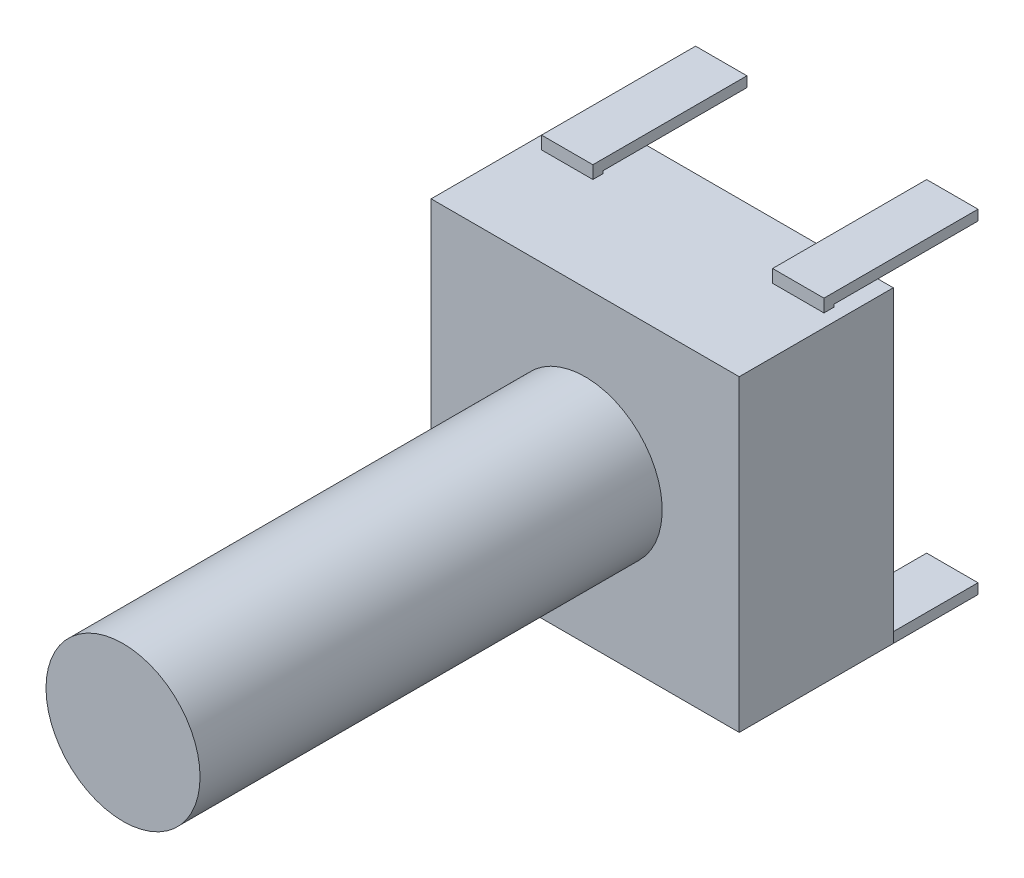
ISO-10303-21;
HEADER;
FILE_DESCRIPTION(('STEP AP214'),'2;1');
FILE_NAME('part.step','',(''),(''),'','','');
FILE_SCHEMA(('AUTOMOTIVE_DESIGN { 1 0 10303 214 1 1 1 1 }'));
ENDSEC;
DATA;
#1=APPLICATION_CONTEXT('core data for automotive mechanical design processes');
#2=APPLICATION_PROTOCOL_DEFINITION('international standard','automotive_design',2000,#1);
#3=PRODUCT_CONTEXT('',#1,'mechanical');
#4=PRODUCT('Part','Part','',(#3));
#5=PRODUCT_RELATED_PRODUCT_CATEGORY('part','',(#4));
#6=PRODUCT_DEFINITION_FORMATION('','',#4);
#7=PRODUCT_DEFINITION_CONTEXT('part definition',#1,'design');
#8=PRODUCT_DEFINITION('design','',#6,#7);
#9=PRODUCT_DEFINITION_SHAPE('','',#8);
#10=(LENGTH_UNIT() NAMED_UNIT(*) SI_UNIT(.MILLI.,.METRE.));
#11=(NAMED_UNIT(*) PLANE_ANGLE_UNIT() SI_UNIT($,.RADIAN.));
#12=(NAMED_UNIT(*) SI_UNIT($,.STERADIAN.) SOLID_ANGLE_UNIT());
#13=UNCERTAINTY_MEASURE_WITH_UNIT(LENGTH_MEASURE(1.E-05),#10,'distance_accuracy_value','');
#14=(GEOMETRIC_REPRESENTATION_CONTEXT(3) GLOBAL_UNCERTAINTY_ASSIGNED_CONTEXT((#13)) GLOBAL_UNIT_ASSIGNED_CONTEXT((#10,
#11,#12)) REPRESENTATION_CONTEXT('',''));
#15=CARTESIAN_POINT('',(0.,0.,0.));
#16=DIRECTION('',(0.,0.,1.));
#17=DIRECTION('',(1.,0.,0.));
#18=AXIS2_PLACEMENT_3D('',#15,#16,#17);
#19=CARTESIAN_POINT('',(-3.00000000000002,3.,3.));
#20=DIRECTION('',(0.,-1.,0.));
#21=DIRECTION('',(0.,0.,-1.));
#22=AXIS2_PLACEMENT_3D('',#19,#20,#21);
#23=PLANE('',#22);
#24=DIRECTION('',(0.,0.,-1.));
#25=VECTOR('',#24,1.);
#26=CARTESIAN_POINT('',(1.75,3.,1.1));
#27=LINE('',#26,#25);
#28=CARTESIAN_POINT('',(1.75,3.,1.1));
#29=VERTEX_POINT('',#28);
#30=CARTESIAN_POINT('',(1.75,3.,0.9));
#31=VERTEX_POINT('',#30);
#32=EDGE_CURVE('E241',#29,#31,#27,.T.);
#33=ORIENTED_EDGE('',*,*,#32,.T.);
#34=DIRECTION('',(1.,0.,0.));
#35=VECTOR('',#34,1.);
#36=CARTESIAN_POINT('',(1.75,3.,0.9));
#37=LINE('',#36,#35);
#38=CARTESIAN_POINT('',(2.75,3.,0.9));
#39=VERTEX_POINT('',#38);
#40=EDGE_CURVE('E54',#31,#39,#37,.T.);
#41=ORIENTED_EDGE('',*,*,#40,.T.);
#42=DIRECTION('',(0.,0.,1.));
#43=VECTOR('',#42,1.);
#44=CARTESIAN_POINT('',(2.75,3.,1.1));
#45=LINE('',#44,#43);
#46=CARTESIAN_POINT('',(2.75,3.,1.1));
#47=VERTEX_POINT('',#46);
#48=EDGE_CURVE('E247',#39,#47,#45,.T.);
#49=ORIENTED_EDGE('',*,*,#48,.T.);
#50=DIRECTION('',(-1.,0.,0.));
#51=VECTOR('',#50,1.);
#52=CARTESIAN_POINT('',(1.75,3.,1.1));
#53=LINE('',#52,#51);
#54=EDGE_CURVE('E231',#47,#29,#53,.T.);
#55=ORIENTED_EDGE('',*,*,#54,.T.);
#56=EDGE_LOOP('',(#33,#41,#49,#55));
#57=FACE_BOUND('',#56,.T.);
#58=DIRECTION('',(-1.,0.,0.));
#59=VECTOR('',#58,1.);
#60=CARTESIAN_POINT('',(-3.00000000000002,3.,0.));
#61=LINE('',#60,#59);
#62=CARTESIAN_POINT('',(3.,3.,0.));
#63=VERTEX_POINT('',#62);
#64=CARTESIAN_POINT('',(-3.00000000000002,3.,0.));
#65=VERTEX_POINT('',#64);
#66=EDGE_CURVE('E445',#63,#65,#61,.T.);
#67=ORIENTED_EDGE('',*,*,#66,.T.);
#68=DIRECTION('',(0.,0.,-1.));
#69=VECTOR('',#68,1.);
#70=CARTESIAN_POINT('',(-3.00000000000002,3.,3.));
#71=LINE('',#70,#69);
#72=CARTESIAN_POINT('',(-3.00000000000002,3.,3.));
#73=VERTEX_POINT('',#72);
#74=EDGE_CURVE('E450',#73,#65,#71,.T.);
#75=ORIENTED_EDGE('',*,*,#74,.F.);
#76=DIRECTION('',(-1.,0.,0.));
#77=VECTOR('',#76,1.);
#78=CARTESIAN_POINT('',(-3.00000000000002,3.,3.));
#79=LINE('',#78,#77);
#80=CARTESIAN_POINT('',(3.,3.,3.));
#81=VERTEX_POINT('',#80);
#82=EDGE_CURVE('E436',#81,#73,#79,.T.);
#83=ORIENTED_EDGE('',*,*,#82,.F.);
#84=DIRECTION('',(0.,0.,-1.));
#85=VECTOR('',#84,1.);
#86=CARTESIAN_POINT('',(3.,3.,3.));
#87=LINE('',#86,#85);
#88=EDGE_CURVE('E453',#81,#63,#87,.T.);
#89=ORIENTED_EDGE('',*,*,#88,.T.);
#90=EDGE_LOOP('',(#67,#75,#83,#89));
#91=FACE_BOUND('',#90,.T.);
#92=DIRECTION('',(0.,0.,-1.));
#93=VECTOR('',#92,1.);
#94=CARTESIAN_POINT('',(-1.75,3.,1.1));
#95=LINE('',#94,#93);
#96=CARTESIAN_POINT('',(-1.75,3.,1.1));
#97=VERTEX_POINT('',#96);
#98=CARTESIAN_POINT('',(-1.75,3.,0.9));
#99=VERTEX_POINT('',#98);
#100=EDGE_CURVE('E62',#97,#99,#95,.T.);
#101=ORIENTED_EDGE('',*,*,#100,.F.);
#102=DIRECTION('',(1.,0.,0.));
#103=VECTOR('',#102,1.);
#104=CARTESIAN_POINT('',(-1.75,3.,1.1));
#105=LINE('',#104,#103);
#106=CARTESIAN_POINT('',(-2.75,3.,1.1));
#107=VERTEX_POINT('',#106);
#108=EDGE_CURVE('E296',#107,#97,#105,.T.);
#109=ORIENTED_EDGE('',*,*,#108,.F.);
#110=DIRECTION('',(0.,0.,1.));
#111=VECTOR('',#110,1.);
#112=CARTESIAN_POINT('',(-2.75,3.,1.1));
#113=LINE('',#112,#111);
#114=CARTESIAN_POINT('',(-2.75,3.,0.9));
#115=VERTEX_POINT('',#114);
#116=EDGE_CURVE('E293',#115,#107,#113,.T.);
#117=ORIENTED_EDGE('',*,*,#116,.F.);
#118=DIRECTION('',(-1.,0.,0.));
#119=VECTOR('',#118,1.);
#120=CARTESIAN_POINT('',(-1.75,3.,0.9));
#121=LINE('',#120,#119);
#122=EDGE_CURVE('E273',#99,#115,#121,.T.);
#123=ORIENTED_EDGE('',*,*,#122,.F.);
#124=EDGE_LOOP('',(#101,#109,#117,#123));
#125=FACE_BOUND('',#124,.T.);
#126=ADVANCED_FACE('F39',(#57,#91,#125),#23,.F.);
#127=CARTESIAN_POINT('',(-3.00000000000002,-3.,3.));
#128=DIRECTION('',(0.,1.,0.));
#129=DIRECTION('',(0.,0.,1.));
#130=AXIS2_PLACEMENT_3D('',#127,#128,#129);
#131=PLANE('',#130);
#132=DIRECTION('',(0.,0.,-1.));
#133=VECTOR('',#132,1.);
#134=CARTESIAN_POINT('',(-1.75,-3.,1.1));
#135=LINE('',#134,#133);
#136=CARTESIAN_POINT('',(-1.75,-3.,1.1));
#137=VERTEX_POINT('',#136);
#138=CARTESIAN_POINT('',(-1.75,-3.,0.9));
#139=VERTEX_POINT('',#138);
#140=EDGE_CURVE('E341',#137,#139,#135,.T.);
#141=ORIENTED_EDGE('',*,*,#140,.T.);
#142=DIRECTION('',(-1.,0.,0.));
#143=VECTOR('',#142,1.);
#144=CARTESIAN_POINT('',(-1.75,-3.,0.9));
#145=LINE('',#144,#143);
#146=CARTESIAN_POINT('',(-2.75,-3.,0.9));
#147=VERTEX_POINT('',#146);
#148=EDGE_CURVE('E278',#139,#147,#145,.T.);
#149=ORIENTED_EDGE('',*,*,#148,.T.);
#150=DIRECTION('',(0.,0.,1.));
#151=VECTOR('',#150,1.);
#152=CARTESIAN_POINT('',(-2.75,-3.,1.1));
#153=LINE('',#152,#151);
#154=CARTESIAN_POINT('',(-2.75,-3.,1.1));
#155=VERTEX_POINT('',#154);
#156=EDGE_CURVE('E347',#147,#155,#153,.T.);
#157=ORIENTED_EDGE('',*,*,#156,.T.);
#158=DIRECTION('',(1.,0.,0.));
#159=VECTOR('',#158,1.);
#160=CARTESIAN_POINT('',(-1.75,-3.,1.1));
#161=LINE('',#160,#159);
#162=EDGE_CURVE('E344',#155,#137,#161,.T.);
#163=ORIENTED_EDGE('',*,*,#162,.T.);
#164=EDGE_LOOP('',(#141,#149,#157,#163));
#165=FACE_BOUND('',#164,.T.);
#166=DIRECTION('',(1.,0.,0.));
#167=VECTOR('',#166,1.);
#168=CARTESIAN_POINT('',(-3.00000000000002,-3.,0.));
#169=LINE('',#168,#167);
#170=CARTESIAN_POINT('',(-3.00000000000002,-3.,0.));
#171=VERTEX_POINT('',#170);
#172=CARTESIAN_POINT('',(3.,-3.,0.));
#173=VERTEX_POINT('',#172);
#174=EDGE_CURVE('E429',#171,#173,#169,.T.);
#175=ORIENTED_EDGE('',*,*,#174,.T.);
#176=DIRECTION('',(0.,0.,-1.));
#177=VECTOR('',#176,1.);
#178=CARTESIAN_POINT('',(3.,-3.,3.));
#179=LINE('',#178,#177);
#180=CARTESIAN_POINT('',(3.,-3.,3.));
#181=VERTEX_POINT('',#180);
#182=EDGE_CURVE('E47',#181,#173,#179,.T.);
#183=ORIENTED_EDGE('',*,*,#182,.F.);
#184=DIRECTION('',(1.,0.,0.));
#185=VECTOR('',#184,1.);
#186=CARTESIAN_POINT('',(-3.00000000000002,-3.,3.));
#187=LINE('',#186,#185);
#188=CARTESIAN_POINT('',(-3.00000000000002,-3.,3.));
#189=VERTEX_POINT('',#188);
#190=EDGE_CURVE('E430',#189,#181,#187,.T.);
#191=ORIENTED_EDGE('',*,*,#190,.F.);
#192=DIRECTION('',(0.,0.,-1.));
#193=VECTOR('',#192,1.);
#194=CARTESIAN_POINT('',(-3.00000000000002,-3.,3.));
#195=LINE('',#194,#193);
#196=EDGE_CURVE('E440',#189,#171,#195,.T.);
#197=ORIENTED_EDGE('',*,*,#196,.T.);
#198=EDGE_LOOP('',(#175,#183,#191,#197));
#199=FACE_BOUND('',#198,.T.);
#200=DIRECTION('',(0.,0.,-1.));
#201=VECTOR('',#200,1.);
#202=CARTESIAN_POINT('',(1.75,-3.,1.1));
#203=LINE('',#202,#201);
#204=CARTESIAN_POINT('',(1.75,-3.,1.1));
#205=VERTEX_POINT('',#204);
#206=CARTESIAN_POINT('',(1.75,-3.,0.899999999999999));
#207=VERTEX_POINT('',#206);
#208=EDGE_CURVE('E397',#205,#207,#203,.T.);
#209=ORIENTED_EDGE('',*,*,#208,.F.);
#210=DIRECTION('',(-1.,0.,0.));
#211=VECTOR('',#210,1.);
#212=CARTESIAN_POINT('',(1.75,-3.,1.1));
#213=LINE('',#212,#211);
#214=CARTESIAN_POINT('',(2.75,-3.,1.1));
#215=VERTEX_POINT('',#214);
#216=EDGE_CURVE('E394',#215,#205,#213,.T.);
#217=ORIENTED_EDGE('',*,*,#216,.F.);
#218=DIRECTION('',(0.,0.,1.));
#219=VECTOR('',#218,1.);
#220=CARTESIAN_POINT('',(2.75,-3.,1.1));
#221=LINE('',#220,#219);
#222=CARTESIAN_POINT('',(2.75,-3.,0.9));
#223=VERTEX_POINT('',#222);
#224=EDGE_CURVE('E391',#223,#215,#221,.T.);
#225=ORIENTED_EDGE('',*,*,#224,.F.);
#226=DIRECTION('',(1.,0.,0.));
#227=VECTOR('',#226,1.);
#228=CARTESIAN_POINT('',(1.75,-3.,0.9));
#229=LINE('',#228,#227);
#230=EDGE_CURVE('E372',#207,#223,#229,.T.);
#231=ORIENTED_EDGE('',*,*,#230,.F.);
#232=EDGE_LOOP('',(#209,#217,#225,#231));
#233=FACE_BOUND('',#232,.T.);
#234=ADVANCED_FACE('F41',(#165,#199,#233),#131,.F.);
#235=CARTESIAN_POINT('',(3.,-3.,3.));
#236=DIRECTION('',(0.,0.,-1.));
#237=DIRECTION('',(-1.,0.,0.));
#238=AXIS2_PLACEMENT_3D('',#235,#236,#237);
#239=PLANE('',#238);
#240=ORIENTED_EDGE('',*,*,#190,.T.);
#241=DIRECTION('',(0.,1.,0.));
#242=VECTOR('',#241,1.);
#243=CARTESIAN_POINT('',(3.,3.,3.));
#244=LINE('',#243,#242);
#245=EDGE_CURVE('E433',#181,#81,#244,.T.);
#246=ORIENTED_EDGE('',*,*,#245,.T.);
#247=ORIENTED_EDGE('',*,*,#82,.T.);
#248=DIRECTION('',(0.,-1.,0.));
#249=VECTOR('',#248,1.);
#250=CARTESIAN_POINT('',(-3.00000000000002,3.,3.));
#251=LINE('',#250,#249);
#252=EDGE_CURVE('E438',#73,#189,#251,.T.);
#253=ORIENTED_EDGE('',*,*,#252,.T.);
#254=EDGE_LOOP('',(#240,#246,#247,#253));
#255=FACE_BOUND('',#254,.T.);
#256=CARTESIAN_POINT('',(0.,0.,3.));
#257=DIRECTION('',(0.,0.,-1.));
#258=DIRECTION('',(-1.,0.,0.));
#259=AXIS2_PLACEMENT_3D('',#256,#257,#258);
#260=CIRCLE('',#259,1.5);
#261=CARTESIAN_POINT('',(-1.5,0.,3.));
#262=VERTEX_POINT('',#261);
#263=EDGE_CURVE('E12',#262,#262,#260,.F.);
#264=ORIENTED_EDGE('',*,*,#263,.F.);
#265=EDGE_LOOP('',(#264));
#266=FACE_BOUND('',#265,.T.);
#267=ADVANCED_FACE('F475',(#255,#266),#239,.F.);
#268=CARTESIAN_POINT('',(3.,3.,3.));
#269=DIRECTION('',(-1.,0.,0.));
#270=DIRECTION('',(0.,0.,1.));
#271=AXIS2_PLACEMENT_3D('',#268,#269,#270);
#272=PLANE('',#271);
#273=DIRECTION('',(0.,1.,0.));
#274=VECTOR('',#273,1.);
#275=CARTESIAN_POINT('',(3.,3.,0.));
#276=LINE('',#275,#274);
#277=EDGE_CURVE('E443',#173,#63,#276,.T.);
#278=ORIENTED_EDGE('',*,*,#277,.T.);
#279=ORIENTED_EDGE('',*,*,#88,.F.);
#280=ORIENTED_EDGE('',*,*,#245,.F.);
#281=ORIENTED_EDGE('',*,*,#182,.T.);
#282=EDGE_LOOP('',(#278,#279,#280,#281));
#283=FACE_BOUND('',#282,.T.);
#284=ADVANCED_FACE('F458',(#283),#272,.F.);
#285=CARTESIAN_POINT('',(-3.00000000000002,3.,3.));
#286=DIRECTION('',(1.,0.,0.));
#287=DIRECTION('',(0.,0.,-1.));
#288=AXIS2_PLACEMENT_3D('',#285,#286,#287);
#289=PLANE('',#288);
#290=DIRECTION('',(0.,-1.,0.));
#291=VECTOR('',#290,1.);
#292=CARTESIAN_POINT('',(-3.00000000000002,3.,0.));
#293=LINE('',#292,#291);
#294=EDGE_CURVE('E434',#65,#171,#293,.T.);
#295=ORIENTED_EDGE('',*,*,#294,.T.);
#296=ORIENTED_EDGE('',*,*,#196,.F.);
#297=ORIENTED_EDGE('',*,*,#252,.F.);
#298=ORIENTED_EDGE('',*,*,#74,.T.);
#299=EDGE_LOOP('',(#295,#296,#297,#298));
#300=FACE_BOUND('',#299,.T.);
#301=ADVANCED_FACE('F473',(#300),#289,.F.);
#302=CARTESIAN_POINT('',(3.,-3.,0.));
#303=DIRECTION('',(0.,0.,-1.));
#304=DIRECTION('',(-1.,0.,0.));
#305=AXIS2_PLACEMENT_3D('',#302,#303,#304);
#306=PLANE('',#305);
#307=ORIENTED_EDGE('',*,*,#174,.F.);
#308=ORIENTED_EDGE('',*,*,#294,.F.);
#309=ORIENTED_EDGE('',*,*,#66,.F.);
#310=ORIENTED_EDGE('',*,*,#277,.F.);
#311=EDGE_LOOP('',(#307,#308,#309,#310));
#312=FACE_BOUND('',#311,.T.);
#313=ADVANCED_FACE('F467',(#312),#306,.T.);
#314=CARTESIAN_POINT('',(0.,0.,12.));
#315=DIRECTION('',(0.,0.,-1.));
#316=DIRECTION('',(-1.,0.,0.));
#317=AXIS2_PLACEMENT_3D('',#314,#315,#316);
#318=CYLINDRICAL_SURFACE('',#317,1.5);
#319=CARTESIAN_POINT('',(0.,0.,12.));
#320=DIRECTION('',(0.,0.,1.));
#321=DIRECTION('',(1.,0.,0.));
#322=AXIS2_PLACEMENT_3D('',#319,#320,#321);
#323=CIRCLE('',#322,1.5);
#324=CARTESIAN_POINT('',(1.5,0.,12.));
#325=VERTEX_POINT('',#324);
#326=EDGE_CURVE('E376',#325,#325,#323,.T.);
#327=ORIENTED_EDGE('',*,*,#326,.F.);
#328=EDGE_LOOP('',(#327));
#329=FACE_BOUND('',#328,.T.);
#330=ORIENTED_EDGE('',*,*,#263,.T.);
#331=EDGE_LOOP('',(#330));
#332=FACE_BOUND('',#331,.T.);
#333=ADVANCED_FACE('F481',(#329,#332),#318,.T.);
#334=CARTESIAN_POINT('',(0.,0.,12.));
#335=DIRECTION('',(0.,0.,1.));
#336=DIRECTION('',(1.,0.,0.));
#337=AXIS2_PLACEMENT_3D('',#334,#335,#336);
#338=PLANE('',#337);
#339=ORIENTED_EDGE('',*,*,#326,.T.);
#340=EDGE_LOOP('',(#339));
#341=FACE_BOUND('',#340,.T.);
#342=ADVANCED_FACE('F483',(#341),#338,.T.);
#343=CARTESIAN_POINT('',(1.75,-3.25,1.1));
#344=DIRECTION('',(0.,-1.,0.));
#345=DIRECTION('',(1.,0.,0.));
#346=AXIS2_PLACEMENT_3D('',#343,#344,#345);
#347=PLANE('',#346);
#348=DIRECTION('',(0.,0.,-1.));
#349=VECTOR('',#348,1.);
#350=CARTESIAN_POINT('',(1.75,-3.25,1.1));
#351=LINE('',#350,#349);
#352=CARTESIAN_POINT('',(1.75,-3.25,1.1));
#353=VERTEX_POINT('',#352);
#354=CARTESIAN_POINT('',(1.75,-3.25,-1.9));
#355=VERTEX_POINT('',#354);
#356=EDGE_CURVE('E413',#353,#355,#351,.T.);
#357=ORIENTED_EDGE('',*,*,#356,.T.);
#358=DIRECTION('',(1.,0.,0.));
#359=VECTOR('',#358,1.);
#360=CARTESIAN_POINT('',(1.75,-3.25,-1.9));
#361=LINE('',#360,#359);
#362=CARTESIAN_POINT('',(2.75,-3.25,-1.9));
#363=VERTEX_POINT('',#362);
#364=EDGE_CURVE('E377',#355,#363,#361,.T.);
#365=ORIENTED_EDGE('',*,*,#364,.T.);
#366=DIRECTION('',(0.,0.,-1.));
#367=VECTOR('',#366,1.);
#368=CARTESIAN_POINT('',(2.75,-3.25,1.1));
#369=LINE('',#368,#367);
#370=CARTESIAN_POINT('',(2.75,-3.25,1.1));
#371=VERTEX_POINT('',#370);
#372=EDGE_CURVE('E416',#371,#363,#369,.T.);
#373=ORIENTED_EDGE('',*,*,#372,.F.);
#374=DIRECTION('',(-1.,0.,0.));
#375=VECTOR('',#374,1.);
#376=CARTESIAN_POINT('',(1.75,-3.25,1.1));
#377=LINE('',#376,#375);
#378=EDGE_CURVE('E384',#371,#353,#377,.T.);
#379=ORIENTED_EDGE('',*,*,#378,.T.);
#380=EDGE_LOOP('',(#357,#365,#373,#379));
#381=FACE_BOUND('',#380,.T.);
#382=ADVANCED_FACE('F490',(#381),#347,.T.);
#383=CARTESIAN_POINT('',(1.75,-3.05,0.9));
#384=DIRECTION('',(0.,1.,0.));
#385=DIRECTION('',(0.,0.,1.));
#386=AXIS2_PLACEMENT_3D('',#383,#384,#385);
#387=PLANE('',#386);
#388=DIRECTION('',(0.,0.,-1.));
#389=VECTOR('',#388,1.);
#390=CARTESIAN_POINT('',(2.75,-3.05,0.9));
#391=LINE('',#390,#389);
#392=CARTESIAN_POINT('',(2.75,-3.05,0.9));
#393=VERTEX_POINT('',#392);
#394=CARTESIAN_POINT('',(2.75,-3.05,-1.9));
#395=VERTEX_POINT('',#394);
#396=EDGE_CURVE('E419',#393,#395,#391,.T.);
#397=ORIENTED_EDGE('',*,*,#396,.T.);
#398=DIRECTION('',(-1.,0.,0.));
#399=VECTOR('',#398,1.);
#400=CARTESIAN_POINT('',(1.75,-3.05,-1.9));
#401=LINE('',#400,#399);
#402=CARTESIAN_POINT('',(1.75,-3.05,-1.9));
#403=VERTEX_POINT('',#402);
#404=EDGE_CURVE('E383',#395,#403,#401,.T.);
#405=ORIENTED_EDGE('',*,*,#404,.T.);
#406=DIRECTION('',(0.,0.,-1.));
#407=VECTOR('',#406,1.);
#408=CARTESIAN_POINT('',(1.75,-3.05,0.9));
#409=LINE('',#408,#407);
#410=CARTESIAN_POINT('',(1.75,-3.05,0.9));
#411=VERTEX_POINT('',#410);
#412=EDGE_CURVE('E422',#411,#403,#409,.T.);
#413=ORIENTED_EDGE('',*,*,#412,.F.);
#414=DIRECTION('',(1.,0.,0.));
#415=VECTOR('',#414,1.);
#416=CARTESIAN_POINT('',(1.75,-3.05,0.9));
#417=LINE('',#416,#415);
#418=EDGE_CURVE('E387',#411,#393,#417,.T.);
#419=ORIENTED_EDGE('',*,*,#418,.T.);
#420=EDGE_LOOP('',(#397,#405,#413,#419));
#421=FACE_BOUND('',#420,.T.);
#422=ADVANCED_FACE('F538',(#421),#387,.T.);
#423=CARTESIAN_POINT('',(1.75,-4.16980390271856,1.1));
#424=DIRECTION('',(1.,0.,0.));
#425=DIRECTION('',(0.,0.,-1.));
#426=AXIS2_PLACEMENT_3D('',#423,#424,#425);
#427=PLANE('',#426);
#428=DIRECTION('',(0.,1.,0.));
#429=VECTOR('',#428,1.);
#430=CARTESIAN_POINT('',(1.75,-4.16980390271856,0.900000000000001));
#431=LINE('',#430,#429);
#432=EDGE_CURVE('E400',#411,#207,#431,.T.);
#433=ORIENTED_EDGE('',*,*,#432,.F.);
#434=ORIENTED_EDGE('',*,*,#412,.T.);
#435=DIRECTION('',(0.,-1.,0.));
#436=VECTOR('',#435,1.);
#437=CARTESIAN_POINT('',(1.75,-3.70990195135928,-1.9));
#438=LINE('',#437,#436);
#439=EDGE_CURVE('E380',#403,#355,#438,.T.);
#440=ORIENTED_EDGE('',*,*,#439,.T.);
#441=ORIENTED_EDGE('',*,*,#356,.F.);
#442=DIRECTION('',(0.,1.,0.));
#443=VECTOR('',#442,1.);
#444=CARTESIAN_POINT('',(1.75,-4.16980390271856,1.1));
#445=LINE('',#444,#443);
#446=EDGE_CURVE('E403',#353,#205,#445,.T.);
#447=ORIENTED_EDGE('',*,*,#446,.T.);
#448=ORIENTED_EDGE('',*,*,#208,.T.);
#449=EDGE_LOOP('',(#433,#434,#440,#441,#447,#448));
#450=FACE_BOUND('',#449,.T.);
#451=ADVANCED_FACE('F548',(#450),#427,.F.);
#452=CARTESIAN_POINT('',(1.75,-4.16980390271856,1.1));
#453=DIRECTION('',(0.,0.,-1.));
#454=DIRECTION('',(0.,1.,0.));
#455=AXIS2_PLACEMENT_3D('',#452,#453,#454);
#456=PLANE('',#455);
#457=ORIENTED_EDGE('',*,*,#378,.F.);
#458=DIRECTION('',(0.,1.,0.));
#459=VECTOR('',#458,1.);
#460=CARTESIAN_POINT('',(2.75,-4.16980390271856,1.1));
#461=LINE('',#460,#459);
#462=EDGE_CURVE('E406',#371,#215,#461,.T.);
#463=ORIENTED_EDGE('',*,*,#462,.T.);
#464=ORIENTED_EDGE('',*,*,#216,.T.);
#465=ORIENTED_EDGE('',*,*,#446,.F.);
#466=EDGE_LOOP('',(#457,#463,#464,#465));
#467=FACE_BOUND('',#466,.T.);
#468=ADVANCED_FACE('F559',(#467),#456,.F.);
#469=CARTESIAN_POINT('',(2.75,-4.16980390271856,1.1));
#470=DIRECTION('',(-1.,0.,0.));
#471=DIRECTION('',(0.,0.,1.));
#472=AXIS2_PLACEMENT_3D('',#469,#470,#471);
#473=PLANE('',#472);
#474=ORIENTED_EDGE('',*,*,#462,.F.);
#475=ORIENTED_EDGE('',*,*,#372,.T.);
#476=DIRECTION('',(0.,1.,0.));
#477=VECTOR('',#476,1.);
#478=CARTESIAN_POINT('',(2.75,-3.70990195135928,-1.9));
#479=LINE('',#478,#477);
#480=EDGE_CURVE('E373',#363,#395,#479,.T.);
#481=ORIENTED_EDGE('',*,*,#480,.T.);
#482=ORIENTED_EDGE('',*,*,#396,.F.);
#483=DIRECTION('',(0.,1.,0.));
#484=VECTOR('',#483,1.);
#485=CARTESIAN_POINT('',(2.75,-4.16980390271856,0.900000000000001));
#486=LINE('',#485,#484);
#487=EDGE_CURVE('E388',#393,#223,#486,.T.);
#488=ORIENTED_EDGE('',*,*,#487,.T.);
#489=ORIENTED_EDGE('',*,*,#224,.T.);
#490=EDGE_LOOP('',(#474,#475,#481,#482,#488,#489));
#491=FACE_BOUND('',#490,.T.);
#492=ADVANCED_FACE('F569',(#491),#473,.F.);
#493=CARTESIAN_POINT('',(1.75,-4.16980390271856,0.900000000000001));
#494=DIRECTION('',(0.,0.,1.));
#495=DIRECTION('',(0.,-1.,0.));
#496=AXIS2_PLACEMENT_3D('',#493,#494,#495);
#497=PLANE('',#496);
#498=ORIENTED_EDGE('',*,*,#418,.F.);
#499=ORIENTED_EDGE('',*,*,#432,.T.);
#500=ORIENTED_EDGE('',*,*,#230,.T.);
#501=ORIENTED_EDGE('',*,*,#487,.F.);
#502=EDGE_LOOP('',(#498,#499,#500,#501));
#503=FACE_BOUND('',#502,.T.);
#504=ADVANCED_FACE('F580',(#503),#497,.F.);
#505=CARTESIAN_POINT('',(2.25,-3.15,-1.9));
#506=DIRECTION('',(0.,0.,-1.));
#507=DIRECTION('',(0.,1.,0.));
#508=AXIS2_PLACEMENT_3D('',#505,#506,#507);
#509=PLANE('',#508);
#510=ORIENTED_EDGE('',*,*,#404,.F.);
#511=ORIENTED_EDGE('',*,*,#480,.F.);
#512=ORIENTED_EDGE('',*,*,#364,.F.);
#513=ORIENTED_EDGE('',*,*,#439,.F.);
#514=EDGE_LOOP('',(#510,#511,#512,#513));
#515=FACE_BOUND('',#514,.T.);
#516=ADVANCED_FACE('F590',(#515),#509,.T.);
#517=CARTESIAN_POINT('',(-1.75,-3.25,1.1));
#518=DIRECTION('',(0.,1.,0.));
#519=DIRECTION('',(-1.,0.,0.));
#520=AXIS2_PLACEMENT_3D('',#517,#518,#519);
#521=PLANE('',#520);
#522=DIRECTION('',(-1.,0.,0.));
#523=VECTOR('',#522,1.);
#524=CARTESIAN_POINT('',(-1.75,-3.25,-1.9));
#525=LINE('',#524,#523);
#526=CARTESIAN_POINT('',(-1.75,-3.25,-1.9));
#527=VERTEX_POINT('',#526);
#528=CARTESIAN_POINT('',(-2.75,-3.25,-1.9));
#529=VERTEX_POINT('',#528);
#530=EDGE_CURVE('E331',#527,#529,#525,.T.);
#531=ORIENTED_EDGE('',*,*,#530,.F.);
#532=DIRECTION('',(0.,0.,-1.));
#533=VECTOR('',#532,1.);
#534=CARTESIAN_POINT('',(-1.75,-3.25,1.1));
#535=LINE('',#534,#533);
#536=CARTESIAN_POINT('',(-1.75,-3.25,1.1));
#537=VERTEX_POINT('',#536);
#538=EDGE_CURVE('E337',#537,#527,#535,.T.);
#539=ORIENTED_EDGE('',*,*,#538,.F.);
#540=DIRECTION('',(1.,0.,0.));
#541=VECTOR('',#540,1.);
#542=CARTESIAN_POINT('',(-1.75,-3.25,1.1));
#543=LINE('',#542,#541);
#544=CARTESIAN_POINT('',(-2.75,-3.25,1.1));
#545=VERTEX_POINT('',#544);
#546=EDGE_CURVE('E334',#545,#537,#543,.T.);
#547=ORIENTED_EDGE('',*,*,#546,.F.);
#548=DIRECTION('',(0.,0.,-1.));
#549=VECTOR('',#548,1.);
#550=CARTESIAN_POINT('',(-2.75,-3.25,1.1));
#551=LINE('',#550,#549);
#552=EDGE_CURVE('E329',#545,#529,#551,.T.);
#553=ORIENTED_EDGE('',*,*,#552,.T.);
#554=EDGE_LOOP('',(#531,#539,#547,#553));
#555=FACE_BOUND('',#554,.T.);
#556=ADVANCED_FACE('F600',(#555),#521,.F.);
#557=CARTESIAN_POINT('',(-1.75,-3.05,0.9));
#558=DIRECTION('',(0.,-1.,0.));
#559=DIRECTION('',(0.,0.,-1.));
#560=AXIS2_PLACEMENT_3D('',#557,#558,#559);
#561=PLANE('',#560);
#562=DIRECTION('',(1.,0.,0.));
#563=VECTOR('',#562,1.);
#564=CARTESIAN_POINT('',(-1.75,-3.05,-1.9));
#565=LINE('',#564,#563);
#566=CARTESIAN_POINT('',(-2.75,-3.05,-1.9));
#567=VERTEX_POINT('',#566);
#568=CARTESIAN_POINT('',(-1.75,-3.05,-1.9));
#569=VERTEX_POINT('',#568);
#570=EDGE_CURVE('E326',#567,#569,#565,.T.);
#571=ORIENTED_EDGE('',*,*,#570,.F.);
#572=DIRECTION('',(0.,0.,-1.));
#573=VECTOR('',#572,1.);
#574=CARTESIAN_POINT('',(-2.75,-3.05,0.9));
#575=LINE('',#574,#573);
#576=CARTESIAN_POINT('',(-2.75,-3.05,0.9));
#577=VERTEX_POINT('',#576);
#578=EDGE_CURVE('E366',#577,#567,#575,.T.);
#579=ORIENTED_EDGE('',*,*,#578,.F.);
#580=DIRECTION('',(-1.,0.,0.));
#581=VECTOR('',#580,1.);
#582=CARTESIAN_POINT('',(-1.75,-3.05,0.9));
#583=LINE('',#582,#581);
#584=CARTESIAN_POINT('',(-1.75,-3.05,0.9));
#585=VERTEX_POINT('',#584);
#586=EDGE_CURVE('E338',#585,#577,#583,.T.);
#587=ORIENTED_EDGE('',*,*,#586,.F.);
#588=DIRECTION('',(0.,0.,-1.));
#589=VECTOR('',#588,1.);
#590=CARTESIAN_POINT('',(-1.75,-3.05,0.9));
#591=LINE('',#590,#589);
#592=EDGE_CURVE('E363',#585,#569,#591,.T.);
#593=ORIENTED_EDGE('',*,*,#592,.T.);
#594=EDGE_LOOP('',(#571,#579,#587,#593));
#595=FACE_BOUND('',#594,.T.);
#596=ADVANCED_FACE('F615',(#595),#561,.F.);
#597=CARTESIAN_POINT('',(-1.75,-4.16980390271856,0.900000000000001));
#598=DIRECTION('',(0.,0.,-1.));
#599=DIRECTION('',(0.,1.,0.));
#600=AXIS2_PLACEMENT_3D('',#597,#598,#599);
#601=PLANE('',#600);
#602=DIRECTION('',(0.,1.,0.));
#603=VECTOR('',#602,1.);
#604=CARTESIAN_POINT('',(-1.75,-4.16980390271856,0.900000000000001));
#605=LINE('',#604,#603);
#606=EDGE_CURVE('E356',#585,#139,#605,.T.);
#607=ORIENTED_EDGE('',*,*,#606,.F.);
#608=ORIENTED_EDGE('',*,*,#586,.T.);
#609=DIRECTION('',(0.,1.,0.));
#610=VECTOR('',#609,1.);
#611=CARTESIAN_POINT('',(-2.75,-4.16980390271856,0.900000000000001));
#612=LINE('',#611,#610);
#613=EDGE_CURVE('E350',#577,#147,#612,.T.);
#614=ORIENTED_EDGE('',*,*,#613,.T.);
#615=ORIENTED_EDGE('',*,*,#148,.F.);
#616=EDGE_LOOP('',(#607,#608,#614,#615));
#617=FACE_BOUND('',#616,.T.);
#618=ADVANCED_FACE('F625',(#617),#601,.T.);
#619=CARTESIAN_POINT('',(-2.75,-4.16980390271856,1.1));
#620=DIRECTION('',(-1.,0.,0.));
#621=DIRECTION('',(0.,0.,1.));
#622=AXIS2_PLACEMENT_3D('',#619,#620,#621);
#623=PLANE('',#622);
#624=ORIENTED_EDGE('',*,*,#613,.F.);
#625=ORIENTED_EDGE('',*,*,#578,.T.);
#626=DIRECTION('',(0.,1.,0.));
#627=VECTOR('',#626,1.);
#628=CARTESIAN_POINT('',(-2.75,-3.70990195135928,-1.9));
#629=LINE('',#628,#627);
#630=EDGE_CURVE('E333',#529,#567,#629,.T.);
#631=ORIENTED_EDGE('',*,*,#630,.F.);
#632=ORIENTED_EDGE('',*,*,#552,.F.);
#633=DIRECTION('',(0.,1.,0.));
#634=VECTOR('',#633,1.);
#635=CARTESIAN_POINT('',(-2.75,-4.16980390271856,1.1));
#636=LINE('',#635,#634);
#637=EDGE_CURVE('E352',#545,#155,#636,.T.);
#638=ORIENTED_EDGE('',*,*,#637,.T.);
#639=ORIENTED_EDGE('',*,*,#156,.F.);
#640=EDGE_LOOP('',(#624,#625,#631,#632,#638,#639));
#641=FACE_BOUND('',#640,.T.);
#642=ADVANCED_FACE('F635',(#641),#623,.T.);
#643=CARTESIAN_POINT('',(-1.75,-4.16980390271856,1.1));
#644=DIRECTION('',(0.,0.,1.));
#645=DIRECTION('',(0.,-1.,0.));
#646=AXIS2_PLACEMENT_3D('',#643,#644,#645);
#647=PLANE('',#646);
#648=ORIENTED_EDGE('',*,*,#637,.F.);
#649=ORIENTED_EDGE('',*,*,#546,.T.);
#650=DIRECTION('',(0.,1.,0.));
#651=VECTOR('',#650,1.);
#652=CARTESIAN_POINT('',(-1.75,-4.16980390271856,1.1));
#653=LINE('',#652,#651);
#654=EDGE_CURVE('E354',#537,#137,#653,.T.);
#655=ORIENTED_EDGE('',*,*,#654,.T.);
#656=ORIENTED_EDGE('',*,*,#162,.F.);
#657=EDGE_LOOP('',(#648,#649,#655,#656));
#658=FACE_BOUND('',#657,.T.);
#659=ADVANCED_FACE('F646',(#658),#647,.T.);
#660=CARTESIAN_POINT('',(-1.75,-4.16980390271856,1.1));
#661=DIRECTION('',(1.,0.,0.));
#662=DIRECTION('',(0.,0.,-1.));
#663=AXIS2_PLACEMENT_3D('',#660,#661,#662);
#664=PLANE('',#663);
#665=ORIENTED_EDGE('',*,*,#654,.F.);
#666=ORIENTED_EDGE('',*,*,#538,.T.);
#667=DIRECTION('',(0.,-1.,0.));
#668=VECTOR('',#667,1.);
#669=CARTESIAN_POINT('',(-1.75,-3.70990195135928,-1.9));
#670=LINE('',#669,#668);
#671=EDGE_CURVE('E328',#569,#527,#670,.T.);
#672=ORIENTED_EDGE('',*,*,#671,.F.);
#673=ORIENTED_EDGE('',*,*,#592,.F.);
#674=ORIENTED_EDGE('',*,*,#606,.T.);
#675=ORIENTED_EDGE('',*,*,#140,.F.);
#676=EDGE_LOOP('',(#665,#666,#672,#673,#674,#675));
#677=FACE_BOUND('',#676,.T.);
#678=ADVANCED_FACE('F656',(#677),#664,.T.);
#679=CARTESIAN_POINT('',(-2.25,-3.15,-1.9));
#680=DIRECTION('',(0.,0.,-1.));
#681=DIRECTION('',(0.,1.,0.));
#682=AXIS2_PLACEMENT_3D('',#679,#680,#681);
#683=PLANE('',#682);
#684=ORIENTED_EDGE('',*,*,#530,.T.);
#685=ORIENTED_EDGE('',*,*,#630,.T.);
#686=ORIENTED_EDGE('',*,*,#570,.T.);
#687=ORIENTED_EDGE('',*,*,#671,.T.);
#688=EDGE_LOOP('',(#684,#685,#686,#687));
#689=FACE_BOUND('',#688,.T.);
#690=ADVANCED_FACE('F667',(#689),#683,.T.);
#691=CARTESIAN_POINT('',(-1.75,3.25,1.1));
#692=DIRECTION('',(0.,1.,0.));
#693=DIRECTION('',(-1.,0.,0.));
#694=AXIS2_PLACEMENT_3D('',#691,#692,#693);
#695=PLANE('',#694);
#696=DIRECTION('',(0.,0.,-1.));
#697=VECTOR('',#696,1.);
#698=CARTESIAN_POINT('',(-1.75,3.25,1.1));
#699=LINE('',#698,#697);
#700=CARTESIAN_POINT('',(-1.75,3.25,1.1));
#701=VERTEX_POINT('',#700);
#702=CARTESIAN_POINT('',(-1.75,3.25,-1.9));
#703=VERTEX_POINT('',#702);
#704=EDGE_CURVE('E312',#701,#703,#699,.T.);
#705=ORIENTED_EDGE('',*,*,#704,.T.);
#706=DIRECTION('',(-1.,0.,0.));
#707=VECTOR('',#706,1.);
#708=CARTESIAN_POINT('',(-1.75,3.25,-1.9));
#709=LINE('',#708,#707);
#710=CARTESIAN_POINT('',(-2.75,3.25,-1.9));
#711=VERTEX_POINT('',#710);
#712=EDGE_CURVE('E279',#703,#711,#709,.T.);
#713=ORIENTED_EDGE('',*,*,#712,.T.);
#714=DIRECTION('',(0.,0.,-1.));
#715=VECTOR('',#714,1.);
#716=CARTESIAN_POINT('',(-2.75,3.25,1.1));
#717=LINE('',#716,#715);
#718=CARTESIAN_POINT('',(-2.75,3.25,1.1));
#719=VERTEX_POINT('',#718);
#720=EDGE_CURVE('E315',#719,#711,#717,.T.);
#721=ORIENTED_EDGE('',*,*,#720,.F.);
#722=DIRECTION('',(1.,0.,0.));
#723=VECTOR('',#722,1.);
#724=CARTESIAN_POINT('',(-1.75,3.25,1.1));
#725=LINE('',#724,#723);
#726=EDGE_CURVE('E286',#719,#701,#725,.T.);
#727=ORIENTED_EDGE('',*,*,#726,.T.);
#728=EDGE_LOOP('',(#705,#713,#721,#727));
#729=FACE_BOUND('',#728,.T.);
#730=ADVANCED_FACE('F676',(#729),#695,.T.);
#731=CARTESIAN_POINT('',(-1.75,3.05,0.9));
#732=DIRECTION('',(0.,-1.,0.));
#733=DIRECTION('',(0.,0.,-1.));
#734=AXIS2_PLACEMENT_3D('',#731,#732,#733);
#735=PLANE('',#734);
#736=DIRECTION('',(0.,0.,-1.));
#737=VECTOR('',#736,1.);
#738=CARTESIAN_POINT('',(-2.75,3.05,0.9));
#739=LINE('',#738,#737);
#740=CARTESIAN_POINT('',(-2.75,3.05,0.9));
#741=VERTEX_POINT('',#740);
#742=CARTESIAN_POINT('',(-2.75,3.05,-1.9));
#743=VERTEX_POINT('',#742);
#744=EDGE_CURVE('E318',#741,#743,#739,.T.);
#745=ORIENTED_EDGE('',*,*,#744,.T.);
#746=DIRECTION('',(1.,0.,0.));
#747=VECTOR('',#746,1.);
#748=CARTESIAN_POINT('',(-1.75,3.05,-1.9));
#749=LINE('',#748,#747);
#750=CARTESIAN_POINT('',(-1.75,3.05,-1.9));
#751=VERTEX_POINT('',#750);
#752=EDGE_CURVE('E285',#743,#751,#749,.T.);
#753=ORIENTED_EDGE('',*,*,#752,.T.);
#754=DIRECTION('',(0.,0.,-1.));
#755=VECTOR('',#754,1.);
#756=CARTESIAN_POINT('',(-1.75,3.05,0.9));
#757=LINE('',#756,#755);
#758=CARTESIAN_POINT('',(-1.75,3.05,0.9));
#759=VERTEX_POINT('',#758);
#760=EDGE_CURVE('E321',#759,#751,#757,.T.);
#761=ORIENTED_EDGE('',*,*,#760,.F.);
#762=DIRECTION('',(-1.,0.,0.));
#763=VECTOR('',#762,1.);
#764=CARTESIAN_POINT('',(-1.75,3.05,0.9));
#765=LINE('',#764,#763);
#766=EDGE_CURVE('E289',#759,#741,#765,.T.);
#767=ORIENTED_EDGE('',*,*,#766,.T.);
#768=EDGE_LOOP('',(#745,#753,#761,#767));
#769=FACE_BOUND('',#768,.T.);
#770=ADVANCED_FACE('F691',(#769),#735,.T.);
#771=CARTESIAN_POINT('',(-1.75,4.16980390271856,1.1));
#772=DIRECTION('',(-1.,0.,0.));
#773=DIRECTION('',(0.,0.,1.));
#774=AXIS2_PLACEMENT_3D('',#771,#772,#773);
#775=PLANE('',#774);
#776=DIRECTION('',(0.,-1.,0.));
#777=VECTOR('',#776,1.);
#778=CARTESIAN_POINT('',(-1.75,4.16980390271856,0.900000000000001));
#779=LINE('',#778,#777);
#780=EDGE_CURVE('E300',#759,#99,#779,.T.);
#781=ORIENTED_EDGE('',*,*,#780,.F.);
#782=ORIENTED_EDGE('',*,*,#760,.T.);
#783=DIRECTION('',(0.,1.,0.));
#784=VECTOR('',#783,1.);
#785=CARTESIAN_POINT('',(-1.75,3.70990195135928,-1.9));
#786=LINE('',#785,#784);
#787=EDGE_CURVE('E282',#751,#703,#786,.T.);
#788=ORIENTED_EDGE('',*,*,#787,.T.);
#789=ORIENTED_EDGE('',*,*,#704,.F.);
#790=DIRECTION('',(0.,-1.,0.));
#791=VECTOR('',#790,1.);
#792=CARTESIAN_POINT('',(-1.75,4.16980390271856,1.1));
#793=LINE('',#792,#791);
#794=EDGE_CURVE('E303',#701,#97,#793,.T.);
#795=ORIENTED_EDGE('',*,*,#794,.T.);
#796=ORIENTED_EDGE('',*,*,#100,.T.);
#797=EDGE_LOOP('',(#781,#782,#788,#789,#795,#796));
#798=FACE_BOUND('',#797,.T.);
#799=ADVANCED_FACE('F701',(#798),#775,.F.);
#800=CARTESIAN_POINT('',(-1.75,4.16980390271856,1.1));
#801=DIRECTION('',(0.,0.,-1.));
#802=DIRECTION('',(0.,1.,0.));
#803=AXIS2_PLACEMENT_3D('',#800,#801,#802);
#804=PLANE('',#803);
#805=ORIENTED_EDGE('',*,*,#726,.F.);
#806=DIRECTION('',(0.,-1.,0.));
#807=VECTOR('',#806,1.);
#808=CARTESIAN_POINT('',(-2.75,4.16980390271856,1.1));
#809=LINE('',#808,#807);
#810=EDGE_CURVE('E305',#719,#107,#809,.T.);
#811=ORIENTED_EDGE('',*,*,#810,.T.);
#812=ORIENTED_EDGE('',*,*,#108,.T.);
#813=ORIENTED_EDGE('',*,*,#794,.F.);
#814=EDGE_LOOP('',(#805,#811,#812,#813));
#815=FACE_BOUND('',#814,.T.);
#816=ADVANCED_FACE('F712',(#815),#804,.F.);
#817=CARTESIAN_POINT('',(-2.75,4.16980390271856,1.1));
#818=DIRECTION('',(1.,0.,0.));
#819=DIRECTION('',(0.,0.,-1.));
#820=AXIS2_PLACEMENT_3D('',#817,#818,#819);
#821=PLANE('',#820);
#822=ORIENTED_EDGE('',*,*,#810,.F.);
#823=ORIENTED_EDGE('',*,*,#720,.T.);
#824=DIRECTION('',(0.,-1.,0.));
#825=VECTOR('',#824,1.);
#826=CARTESIAN_POINT('',(-2.75,3.70990195135928,-1.9));
#827=LINE('',#826,#825);
#828=EDGE_CURVE('E275',#711,#743,#827,.T.);
#829=ORIENTED_EDGE('',*,*,#828,.T.);
#830=ORIENTED_EDGE('',*,*,#744,.F.);
#831=DIRECTION('',(0.,-1.,0.));
#832=VECTOR('',#831,1.);
#833=CARTESIAN_POINT('',(-2.75,4.16980390271856,0.900000000000001));
#834=LINE('',#833,#832);
#835=EDGE_CURVE('E290',#741,#115,#834,.T.);
#836=ORIENTED_EDGE('',*,*,#835,.T.);
#837=ORIENTED_EDGE('',*,*,#116,.T.);
#838=EDGE_LOOP('',(#822,#823,#829,#830,#836,#837));
#839=FACE_BOUND('',#838,.T.);
#840=ADVANCED_FACE('F722',(#839),#821,.F.);
#841=CARTESIAN_POINT('',(-1.75,4.16980390271856,0.900000000000001));
#842=DIRECTION('',(0.,0.,1.));
#843=DIRECTION('',(0.,-1.,0.));
#844=AXIS2_PLACEMENT_3D('',#841,#842,#843);
#845=PLANE('',#844);
#846=ORIENTED_EDGE('',*,*,#766,.F.);
#847=ORIENTED_EDGE('',*,*,#780,.T.);
#848=ORIENTED_EDGE('',*,*,#122,.T.);
#849=ORIENTED_EDGE('',*,*,#835,.F.);
#850=EDGE_LOOP('',(#846,#847,#848,#849));
#851=FACE_BOUND('',#850,.T.);
#852=ADVANCED_FACE('F733',(#851),#845,.F.);
#853=CARTESIAN_POINT('',(-2.25,3.15,-1.9));
#854=DIRECTION('',(0.,0.,-1.));
#855=DIRECTION('',(0.,1.,0.));
#856=AXIS2_PLACEMENT_3D('',#853,#854,#855);
#857=PLANE('',#856);
#858=ORIENTED_EDGE('',*,*,#752,.F.);
#859=ORIENTED_EDGE('',*,*,#828,.F.);
#860=ORIENTED_EDGE('',*,*,#712,.F.);
#861=ORIENTED_EDGE('',*,*,#787,.F.);
#862=EDGE_LOOP('',(#858,#859,#860,#861));
#863=FACE_BOUND('',#862,.T.);
#864=ADVANCED_FACE('F743',(#863),#857,.T.);
#865=CARTESIAN_POINT('',(1.75,3.25,1.1));
#866=DIRECTION('',(0.,-1.,0.));
#867=DIRECTION('',(1.,0.,0.));
#868=AXIS2_PLACEMENT_3D('',#865,#866,#867);
#869=PLANE('',#868);
#870=DIRECTION('',(1.,0.,0.));
#871=VECTOR('',#870,1.);
#872=CARTESIAN_POINT('',(1.75,3.25,-1.9));
#873=LINE('',#872,#871);
#874=CARTESIAN_POINT('',(1.75,3.25,-1.9));
#875=VERTEX_POINT('',#874);
#876=CARTESIAN_POINT('',(2.75,3.25,-1.9));
#877=VERTEX_POINT('',#876);
#878=EDGE_CURVE('E274',#875,#877,#873,.T.);
#879=ORIENTED_EDGE('',*,*,#878,.F.);
#880=DIRECTION('',(0.,0.,-1.));
#881=VECTOR('',#880,1.);
#882=CARTESIAN_POINT('',(1.75,3.25,1.1));
#883=LINE('',#882,#881);
#884=CARTESIAN_POINT('',(1.75,3.25,1.1));
#885=VERTEX_POINT('',#884);
#886=EDGE_CURVE('E259',#885,#875,#883,.T.);
#887=ORIENTED_EDGE('',*,*,#886,.F.);
#888=DIRECTION('',(-1.,0.,0.));
#889=VECTOR('',#888,1.);
#890=CARTESIAN_POINT('',(1.75,3.25,1.1));
#891=LINE('',#890,#889);
#892=CARTESIAN_POINT('',(2.75,3.25,1.1));
#893=VERTEX_POINT('',#892);
#894=EDGE_CURVE('E234',#893,#885,#891,.T.);
#895=ORIENTED_EDGE('',*,*,#894,.F.);
#896=DIRECTION('',(0.,0.,-1.));
#897=VECTOR('',#896,1.);
#898=CARTESIAN_POINT('',(2.75,3.25,1.1));
#899=LINE('',#898,#897);
#900=EDGE_CURVE('E267',#893,#877,#899,.T.);
#901=ORIENTED_EDGE('',*,*,#900,.T.);
#902=EDGE_LOOP('',(#879,#887,#895,#901));
#903=FACE_BOUND('',#902,.T.);
#904=ADVANCED_FACE('F753',(#903),#869,.F.);
#905=CARTESIAN_POINT('',(1.75,3.05,0.9));
#906=DIRECTION('',(0.,1.,0.));
#907=DIRECTION('',(0.,0.,1.));
#908=AXIS2_PLACEMENT_3D('',#905,#906,#907);
#909=PLANE('',#908);
#910=DIRECTION('',(-1.,0.,0.));
#911=VECTOR('',#910,1.);
#912=CARTESIAN_POINT('',(1.75,3.05,-1.9));
#913=LINE('',#912,#911);
#914=CARTESIAN_POINT('',(2.75,3.05,-1.9));
#915=VERTEX_POINT('',#914);
#916=CARTESIAN_POINT('',(1.75,3.05,-1.9));
#917=VERTEX_POINT('',#916);
#918=EDGE_CURVE('E270',#915,#917,#913,.T.);
#919=ORIENTED_EDGE('',*,*,#918,.F.);
#920=DIRECTION('',(0.,0.,-1.));
#921=VECTOR('',#920,1.);
#922=CARTESIAN_POINT('',(2.75,3.05,0.9));
#923=LINE('',#922,#921);
#924=CARTESIAN_POINT('',(2.75,3.05,0.9));
#925=VERTEX_POINT('',#924);
#926=EDGE_CURVE('E264',#925,#915,#923,.T.);
#927=ORIENTED_EDGE('',*,*,#926,.F.);
#928=DIRECTION('',(1.,0.,0.));
#929=VECTOR('',#928,1.);
#930=CARTESIAN_POINT('',(1.75,3.05,0.9));
#931=LINE('',#930,#929);
#932=CARTESIAN_POINT('',(1.75,3.05,0.9));
#933=VERTEX_POINT('',#932);
#934=EDGE_CURVE('E256',#933,#925,#931,.T.);
#935=ORIENTED_EDGE('',*,*,#934,.F.);
#936=DIRECTION('',(0.,0.,-1.));
#937=VECTOR('',#936,1.);
#938=CARTESIAN_POINT('',(1.75,3.05,0.9));
#939=LINE('',#938,#937);
#940=EDGE_CURVE('E261',#933,#917,#939,.T.);
#941=ORIENTED_EDGE('',*,*,#940,.T.);
#942=EDGE_LOOP('',(#919,#927,#935,#941));
#943=FACE_BOUND('',#942,.T.);
#944=ADVANCED_FACE('F763',(#943),#909,.F.);
#945=CARTESIAN_POINT('',(1.75,4.16980390271856,0.900000000000001));
#946=DIRECTION('',(0.,0.,-1.));
#947=DIRECTION('',(0.,1.,0.));
#948=AXIS2_PLACEMENT_3D('',#945,#946,#947);
#949=PLANE('',#948);
#950=DIRECTION('',(0.,-1.,0.));
#951=VECTOR('',#950,1.);
#952=CARTESIAN_POINT('',(1.75,4.16980390271856,0.900000000000001));
#953=LINE('',#952,#951);
#954=EDGE_CURVE('E237',#933,#31,#953,.T.);
#955=ORIENTED_EDGE('',*,*,#954,.F.);
#956=ORIENTED_EDGE('',*,*,#934,.T.);
#957=DIRECTION('',(0.,-1.,0.));
#958=VECTOR('',#957,1.);
#959=CARTESIAN_POINT('',(2.75,4.16980390271856,0.900000000000001));
#960=LINE('',#959,#958);
#961=EDGE_CURVE('E249',#925,#39,#960,.T.);
#962=ORIENTED_EDGE('',*,*,#961,.T.);
#963=ORIENTED_EDGE('',*,*,#40,.F.);
#964=EDGE_LOOP('',(#955,#956,#962,#963));
#965=FACE_BOUND('',#964,.T.);
#966=ADVANCED_FACE('F773',(#965),#949,.T.);
#967=CARTESIAN_POINT('',(2.75,4.16980390271856,1.1));
#968=DIRECTION('',(1.,0.,0.));
#969=DIRECTION('',(0.,0.,-1.));
#970=AXIS2_PLACEMENT_3D('',#967,#968,#969);
#971=PLANE('',#970);
#972=ORIENTED_EDGE('',*,*,#961,.F.);
#973=ORIENTED_EDGE('',*,*,#926,.T.);
#974=DIRECTION('',(0.,-1.,0.));
#975=VECTOR('',#974,1.);
#976=CARTESIAN_POINT('',(2.75,3.70990195135928,-1.9));
#977=LINE('',#976,#975);
#978=EDGE_CURVE('E271',#877,#915,#977,.T.);
#979=ORIENTED_EDGE('',*,*,#978,.F.);
#980=ORIENTED_EDGE('',*,*,#900,.F.);
#981=DIRECTION('',(0.,-1.,0.));
#982=VECTOR('',#981,1.);
#983=CARTESIAN_POINT('',(2.75,4.16980390271856,1.1));
#984=LINE('',#983,#982);
#985=EDGE_CURVE('E238',#893,#47,#984,.T.);
#986=ORIENTED_EDGE('',*,*,#985,.T.);
#987=ORIENTED_EDGE('',*,*,#48,.F.);
#988=EDGE_LOOP('',(#972,#973,#979,#980,#986,#987));
#989=FACE_BOUND('',#988,.T.);
#990=ADVANCED_FACE('F783',(#989),#971,.T.);
#991=CARTESIAN_POINT('',(1.75,4.16980390271856,1.1));
#992=DIRECTION('',(0.,0.,1.));
#993=DIRECTION('',(0.,-1.,0.));
#994=AXIS2_PLACEMENT_3D('',#991,#992,#993);
#995=PLANE('',#994);
#996=ORIENTED_EDGE('',*,*,#985,.F.);
#997=ORIENTED_EDGE('',*,*,#894,.T.);
#998=DIRECTION('',(0.,-1.,0.));
#999=VECTOR('',#998,1.);
#1000=CARTESIAN_POINT('',(1.75,4.16980390271856,1.1));
#1001=LINE('',#1000,#999);
#1002=EDGE_CURVE('E226',#885,#29,#1001,.T.);
#1003=ORIENTED_EDGE('',*,*,#1002,.T.);
#1004=ORIENTED_EDGE('',*,*,#54,.F.);
#1005=EDGE_LOOP('',(#996,#997,#1003,#1004));
#1006=FACE_BOUND('',#1005,.T.);
#1007=ADVANCED_FACE('F229',(#1006),#995,.T.);
#1008=CARTESIAN_POINT('',(1.75,4.16980390271856,1.1));
#1009=DIRECTION('',(-1.,0.,0.));
#1010=DIRECTION('',(0.,0.,1.));
#1011=AXIS2_PLACEMENT_3D('',#1008,#1009,#1010);
#1012=PLANE('',#1011);
#1013=ORIENTED_EDGE('',*,*,#1002,.F.);
#1014=ORIENTED_EDGE('',*,*,#886,.T.);
#1015=DIRECTION('',(0.,1.,0.));
#1016=VECTOR('',#1015,1.);
#1017=CARTESIAN_POINT('',(1.75,3.70990195135928,-1.9));
#1018=LINE('',#1017,#1016);
#1019=EDGE_CURVE('E828',#917,#875,#1018,.T.);
#1020=ORIENTED_EDGE('',*,*,#1019,.F.);
#1021=ORIENTED_EDGE('',*,*,#940,.F.);
#1022=ORIENTED_EDGE('',*,*,#954,.T.);
#1023=ORIENTED_EDGE('',*,*,#32,.F.);
#1024=EDGE_LOOP('',(#1013,#1014,#1020,#1021,#1022,#1023));
#1025=FACE_BOUND('',#1024,.T.);
#1026=ADVANCED_FACE('F242',(#1025),#1012,.T.);
#1027=CARTESIAN_POINT('',(2.25,3.15,-1.9));
#1028=DIRECTION('',(0.,0.,-1.));
#1029=DIRECTION('',(0.,1.,0.));
#1030=AXIS2_PLACEMENT_3D('',#1027,#1028,#1029);
#1031=PLANE('',#1030);
#1032=ORIENTED_EDGE('',*,*,#878,.T.);
#1033=ORIENTED_EDGE('',*,*,#978,.T.);
#1034=ORIENTED_EDGE('',*,*,#918,.T.);
#1035=ORIENTED_EDGE('',*,*,#1019,.T.);
#1036=EDGE_LOOP('',(#1032,#1033,#1034,#1035));
#1037=FACE_BOUND('',#1036,.T.);
#1038=ADVANCED_FACE('F811',(#1037),#1031,.T.);
#1039=CLOSED_SHELL('',(#126,#234,#267,#284,#301,#313,#333,#342,#382,#422,#451,#468,#492,#504,
#516,#556,#596,#618,#642,#659,#678,#690,#730,#770,#799,#816,#840,#852,#864,#904,#944,#966,#990,
#1007,#1026,#1038));
#1040=MANIFOLD_SOLID_BREP('B2',#1039);
#1041=ADVANCED_BREP_SHAPE_REPRESENTATION('',(#18,#1040),#14);
#1042=SHAPE_DEFINITION_REPRESENTATION(#9,#1041);
ENDSEC;
END-ISO-10303-21;
